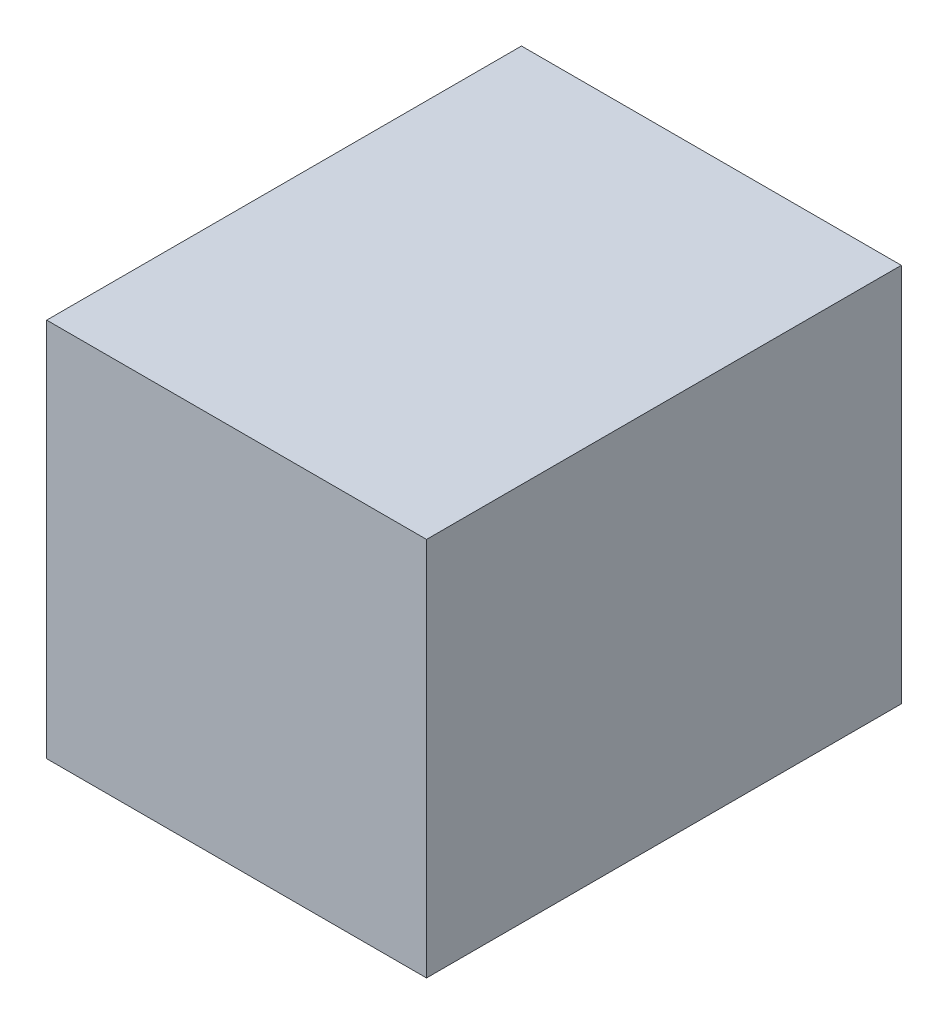
ISO-10303-21;
HEADER;
FILE_DESCRIPTION(('STEP AP214'),'2;1');
FILE_NAME('part.step','',(''),(''),'','','');
FILE_SCHEMA(('AUTOMOTIVE_DESIGN { 1 0 10303 214 1 1 1 1 }'));
ENDSEC;
DATA;
#1=APPLICATION_CONTEXT('core data for automotive mechanical design processes');
#2=APPLICATION_PROTOCOL_DEFINITION('international standard','automotive_design',2000,#1);
#3=PRODUCT_CONTEXT('',#1,'mechanical');
#4=PRODUCT('Part','Part','',(#3));
#5=PRODUCT_RELATED_PRODUCT_CATEGORY('part','',(#4));
#6=PRODUCT_DEFINITION_FORMATION('','',#4);
#7=PRODUCT_DEFINITION_CONTEXT('part definition',#1,'design');
#8=PRODUCT_DEFINITION('design','',#6,#7);
#9=PRODUCT_DEFINITION_SHAPE('','',#8);
#10=(LENGTH_UNIT() NAMED_UNIT(*) SI_UNIT(.MILLI.,.METRE.));
#11=(NAMED_UNIT(*) PLANE_ANGLE_UNIT() SI_UNIT($,.RADIAN.));
#12=(NAMED_UNIT(*) SI_UNIT($,.STERADIAN.) SOLID_ANGLE_UNIT());
#13=UNCERTAINTY_MEASURE_WITH_UNIT(LENGTH_MEASURE(1.E-05),#10,'distance_accuracy_value','');
#14=(GEOMETRIC_REPRESENTATION_CONTEXT(3) GLOBAL_UNCERTAINTY_ASSIGNED_CONTEXT((#13)) GLOBAL_UNIT_ASSIGNED_CONTEXT((#10,
#11,#12)) REPRESENTATION_CONTEXT('',''));
#15=CARTESIAN_POINT('',(0.,0.,0.));
#16=DIRECTION('',(0.,0.,1.));
#17=DIRECTION('',(1.,0.,0.));
#18=AXIS2_PLACEMENT_3D('',#15,#16,#17);
#19=CARTESIAN_POINT('',(-0.09999999776483,0.3,-0.699999984354));
#20=DIRECTION('',(-1.,0.,0.));
#21=DIRECTION('',(0.,0.,1.));
#22=AXIS2_PLACEMENT_3D('',#19,#20,#21);
#23=PLANE('',#22);
#24=DIRECTION('',(0.,0.,-1.));
#25=VECTOR('',#24,1.);
#26=CARTESIAN_POINT('',(-0.09999999776483,0.3,-0.449999989942));
#27=LINE('',#26,#25);
#28=CARTESIAN_POINT('',(-0.09999999776483,0.3,-0.449999989942));
#29=VERTEX_POINT('',#28);
#30=CARTESIAN_POINT('',(-0.09999999776483,0.3,-0.699999984354));
#31=VERTEX_POINT('',#30);
#32=EDGE_CURVE('E78',#29,#31,#27,.T.);
#33=ORIENTED_EDGE('',*,*,#32,.F.);
#34=DIRECTION('',(0.,1.,0.));
#35=VECTOR('',#34,1.);
#36=CARTESIAN_POINT('',(-0.09999999776483,0.3,-0.449999989942));
#37=LINE('',#36,#35);
#38=CARTESIAN_POINT('',(-0.09999999776483,0.5,-0.449999989942));
#39=VERTEX_POINT('',#38);
#40=EDGE_CURVE('E65',#29,#39,#37,.T.);
#41=ORIENTED_EDGE('',*,*,#40,.T.);
#42=DIRECTION('',(0.,0.,1.));
#43=VECTOR('',#42,1.);
#44=CARTESIAN_POINT('',(-0.09999999776483,0.5,-0.449999989942));
#45=LINE('',#44,#43);
#46=CARTESIAN_POINT('',(-0.09999999776483,0.5,-0.699999984354));
#47=VERTEX_POINT('',#46);
#48=EDGE_CURVE('E116',#47,#39,#45,.T.);
#49=ORIENTED_EDGE('',*,*,#48,.F.);
#50=DIRECTION('',(0.,1.,0.));
#51=VECTOR('',#50,1.);
#52=CARTESIAN_POINT('',(-0.09999999776483,0.3,-0.699999984354));
#53=LINE('',#52,#51);
#54=EDGE_CURVE('E11',#31,#47,#53,.T.);
#55=ORIENTED_EDGE('',*,*,#54,.F.);
#56=EDGE_LOOP('',(#33,#41,#49,#55));
#57=FACE_BOUND('',#56,.T.);
#58=ADVANCED_FACE('F17',(#57),#23,.T.);
#59=CARTESIAN_POINT('',(0.09999999776483,0.3,-0.699999984354));
#60=DIRECTION('',(0.,0.,-1.));
#61=DIRECTION('',(0.,-1.,0.));
#62=AXIS2_PLACEMENT_3D('',#59,#60,#61);
#63=PLANE('',#62);
#64=DIRECTION('',(1.,0.,0.));
#65=VECTOR('',#64,1.);
#66=CARTESIAN_POINT('',(-0.09999999776483,0.3,-0.699999984354));
#67=LINE('',#66,#65);
#68=CARTESIAN_POINT('',(0.09999999776483,0.3,-0.699999984354));
#69=VERTEX_POINT('',#68);
#70=EDGE_CURVE('E82',#31,#69,#67,.T.);
#71=ORIENTED_EDGE('',*,*,#70,.F.);
#72=ORIENTED_EDGE('',*,*,#54,.T.);
#73=DIRECTION('',(-1.,0.,0.));
#74=VECTOR('',#73,1.);
#75=CARTESIAN_POINT('',(-0.09999999776483,0.5,-0.699999984354));
#76=LINE('',#75,#74);
#77=CARTESIAN_POINT('',(0.09999999776483,0.5,-0.699999984354));
#78=VERTEX_POINT('',#77);
#79=EDGE_CURVE('E21',#78,#47,#76,.T.);
#80=ORIENTED_EDGE('',*,*,#79,.F.);
#81=DIRECTION('',(0.,1.,0.));
#82=VECTOR('',#81,1.);
#83=CARTESIAN_POINT('',(0.09999999776483,0.3,-0.699999984354));
#84=LINE('',#83,#82);
#85=EDGE_CURVE('E28',#69,#78,#84,.T.);
#86=ORIENTED_EDGE('',*,*,#85,.F.);
#87=EDGE_LOOP('',(#71,#72,#80,#86));
#88=FACE_BOUND('',#87,.T.);
#89=ADVANCED_FACE('F109',(#88),#63,.T.);
#90=CARTESIAN_POINT('',(0.09999999776483,0.3,-0.449999989942));
#91=DIRECTION('',(1.,0.,0.));
#92=DIRECTION('',(0.,1.,0.));
#93=AXIS2_PLACEMENT_3D('',#90,#91,#92);
#94=PLANE('',#93);
#95=DIRECTION('',(0.,0.,1.));
#96=VECTOR('',#95,1.);
#97=CARTESIAN_POINT('',(0.09999999776483,0.3,-0.699999984354));
#98=LINE('',#97,#96);
#99=CARTESIAN_POINT('',(0.09999999776483,0.3,-0.449999989942));
#100=VERTEX_POINT('',#99);
#101=EDGE_CURVE('E87',#69,#100,#98,.T.);
#102=ORIENTED_EDGE('',*,*,#101,.F.);
#103=ORIENTED_EDGE('',*,*,#85,.T.);
#104=DIRECTION('',(0.,0.,-1.));
#105=VECTOR('',#104,1.);
#106=CARTESIAN_POINT('',(0.09999999776483,0.5,-0.699999984354));
#107=LINE('',#106,#105);
#108=CARTESIAN_POINT('',(0.09999999776483,0.5,-0.449999989942));
#109=VERTEX_POINT('',#108);
#110=EDGE_CURVE('E98',#109,#78,#107,.T.);
#111=ORIENTED_EDGE('',*,*,#110,.F.);
#112=DIRECTION('',(0.,1.,0.));
#113=VECTOR('',#112,1.);
#114=CARTESIAN_POINT('',(0.09999999776483,0.3,-0.449999989942));
#115=LINE('',#114,#113);
#116=EDGE_CURVE('E75',#100,#109,#115,.T.);
#117=ORIENTED_EDGE('',*,*,#116,.F.);
#118=EDGE_LOOP('',(#102,#103,#111,#117));
#119=FACE_BOUND('',#118,.T.);
#120=ADVANCED_FACE('F19',(#119),#94,.T.);
#121=CARTESIAN_POINT('',(-0.09999999776483,0.3,-0.449999989942));
#122=DIRECTION('',(0.,0.,1.));
#123=DIRECTION('',(1.,0.,0.));
#124=AXIS2_PLACEMENT_3D('',#121,#122,#123);
#125=PLANE('',#124);
#126=DIRECTION('',(-1.,0.,0.));
#127=VECTOR('',#126,1.);
#128=CARTESIAN_POINT('',(0.09999999776483,0.3,-0.449999989942));
#129=LINE('',#128,#127);
#130=EDGE_CURVE('E69',#100,#29,#129,.T.);
#131=ORIENTED_EDGE('',*,*,#130,.F.);
#132=ORIENTED_EDGE('',*,*,#116,.T.);
#133=DIRECTION('',(1.,0.,0.));
#134=VECTOR('',#133,1.);
#135=CARTESIAN_POINT('',(0.09999999776483,0.5,-0.449999989942));
#136=LINE('',#135,#134);
#137=EDGE_CURVE('E71',#39,#109,#136,.T.);
#138=ORIENTED_EDGE('',*,*,#137,.F.);
#139=ORIENTED_EDGE('',*,*,#40,.F.);
#140=EDGE_LOOP('',(#131,#132,#138,#139));
#141=FACE_BOUND('',#140,.T.);
#142=ADVANCED_FACE('F67',(#141),#125,.T.);
#143=CARTESIAN_POINT('',(0.,0.5,-0.574999987148));
#144=DIRECTION('',(0.,1.,0.));
#145=DIRECTION('',(1.,0.,0.));
#146=AXIS2_PLACEMENT_3D('',#143,#144,#145);
#147=PLANE('',#146);
#148=ORIENTED_EDGE('',*,*,#137,.T.);
#149=ORIENTED_EDGE('',*,*,#110,.T.);
#150=ORIENTED_EDGE('',*,*,#79,.T.);
#151=ORIENTED_EDGE('',*,*,#48,.T.);
#152=EDGE_LOOP('',(#148,#149,#150,#151));
#153=FACE_BOUND('',#152,.T.);
#154=ADVANCED_FACE('F127',(#153),#147,.T.);
#155=CARTESIAN_POINT('',(0.,0.3,-0.574999987148));
#156=DIRECTION('',(0.,1.,0.));
#157=DIRECTION('',(1.,0.,0.));
#158=AXIS2_PLACEMENT_3D('',#155,#156,#157);
#159=PLANE('',#158);
#160=ORIENTED_EDGE('',*,*,#130,.T.);
#161=ORIENTED_EDGE('',*,*,#32,.T.);
#162=ORIENTED_EDGE('',*,*,#70,.T.);
#163=ORIENTED_EDGE('',*,*,#101,.T.);
#164=EDGE_LOOP('',(#160,#161,#162,#163));
#165=FACE_BOUND('',#164,.T.);
#166=ADVANCED_FACE('F85',(#165),#159,.F.);
#167=CLOSED_SHELL('',(#58,#89,#120,#142,#154,#166));
#168=MANIFOLD_SOLID_BREP('B1',#167);
#169=ADVANCED_BREP_SHAPE_REPRESENTATION('',(#18,#168),#14);
#170=SHAPE_DEFINITION_REPRESENTATION(#9,#169);
ENDSEC;
END-ISO-10303-21;
